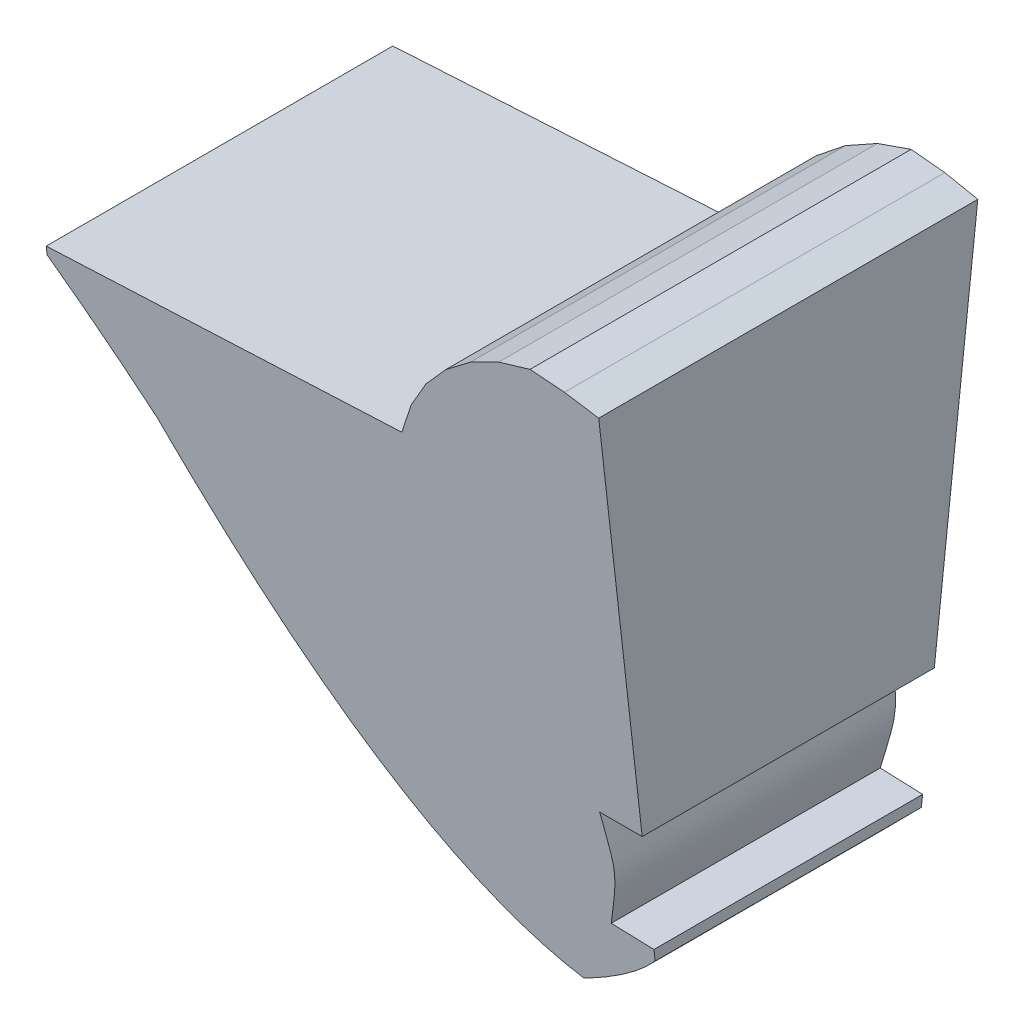
ISO-10303-21;
HEADER;
FILE_DESCRIPTION(('STEP AP214'),'2;1');
FILE_NAME('part.step','',(''),(''),'','','');
FILE_SCHEMA(('AUTOMOTIVE_DESIGN { 1 0 10303 214 1 1 1 1 }'));
ENDSEC;
DATA;
#1=APPLICATION_CONTEXT('core data for automotive mechanical design processes');
#2=APPLICATION_PROTOCOL_DEFINITION('international standard','automotive_design',2000,#1);
#3=PRODUCT_CONTEXT('',#1,'mechanical');
#4=PRODUCT('Part','Part','',(#3));
#5=PRODUCT_RELATED_PRODUCT_CATEGORY('part','',(#4));
#6=PRODUCT_DEFINITION_FORMATION('','',#4);
#7=PRODUCT_DEFINITION_CONTEXT('part definition',#1,'design');
#8=PRODUCT_DEFINITION('design','',#6,#7);
#9=PRODUCT_DEFINITION_SHAPE('','',#8);
#10=(LENGTH_UNIT() NAMED_UNIT(*) SI_UNIT(.MILLI.,.METRE.));
#11=(NAMED_UNIT(*) PLANE_ANGLE_UNIT() SI_UNIT($,.RADIAN.));
#12=(NAMED_UNIT(*) SI_UNIT($,.STERADIAN.) SOLID_ANGLE_UNIT());
#13=UNCERTAINTY_MEASURE_WITH_UNIT(LENGTH_MEASURE(1.E-05),#10,'distance_accuracy_value','');
#14=(GEOMETRIC_REPRESENTATION_CONTEXT(3) GLOBAL_UNCERTAINTY_ASSIGNED_CONTEXT((#13)) GLOBAL_UNIT_ASSIGNED_CONTEXT((#10,
#11,#12)) REPRESENTATION_CONTEXT('',''));
#15=CARTESIAN_POINT('',(0.,0.,0.));
#16=DIRECTION('',(0.,0.,1.));
#17=DIRECTION('',(1.,0.,0.));
#18=AXIS2_PLACEMENT_3D('',#15,#16,#17);
#19=CARTESIAN_POINT('',(0.355125000055651,-1.23774703808888E-13,7.21));
#20=DIRECTION('',(-1.,3.48538412642003E-13,0.));
#21=DIRECTION('',(-3.48538412642003E-13,-1.,0.));
#22=AXIS2_PLACEMENT_3D('',#19,#20,#21);
#23=PLANE('',#22);
#24=DIRECTION('',(0.,-0.993653373689782,0.112485434412263));
#25=VECTOR('',#24,1.);
#26=CARTESIAN_POINT('',(0.355125000056697,12.6081551722012,-7.21));
#27=LINE('',#26,#25);
#28=CARTESIAN_POINT('',(0.355125000056697,17.7734661064821,-7.79473332824248));
#29=VERTEX_POINT('',#28);
#30=CARTESIAN_POINT('',(0.355125000056447,1.97626956518499,-6.00642911422341));
#31=VERTEX_POINT('',#30);
#32=EDGE_CURVE('E58',#29,#31,#27,.T.);
#33=ORIENTED_EDGE('',*,*,#32,.F.);
#34=DIRECTION('',(0.,0.,-1.));
#35=VECTOR('',#34,1.);
#36=CARTESIAN_POINT('',(0.355125000056697,17.7734661064821,25.2255551646788));
#37=LINE('',#36,#35);
#38=CARTESIAN_POINT('',(0.355125000056697,17.7734661064821,7.79473332824248));
#39=VERTEX_POINT('',#38);
#40=EDGE_CURVE('E192',#39,#29,#37,.T.);
#41=ORIENTED_EDGE('',*,*,#40,.F.);
#42=DIRECTION('',(0.,0.993653373689782,0.112485434412263));
#43=VECTOR('',#42,1.);
#44=CARTESIAN_POINT('',(0.355125000056697,12.6081551722012,7.21));
#45=LINE('',#44,#43);
#46=CARTESIAN_POINT('',(0.355125000056697,1.97626956518499,6.00642911422342));
#47=VERTEX_POINT('',#46);
#48=EDGE_CURVE('E244',#47,#39,#45,.T.);
#49=ORIENTED_EDGE('',*,*,#48,.F.);
#50=DIRECTION('',(0.,0.,-1.));
#51=VECTOR('',#50,1.);
#52=CARTESIAN_POINT('',(0.355125000056447,1.97626956518499,7.21));
#53=LINE('',#52,#51);
#54=EDGE_CURVE('E316',#47,#31,#53,.T.);
#55=ORIENTED_EDGE('',*,*,#54,.T.);
#56=EDGE_LOOP('',(#33,#41,#49,#55));
#57=FACE_BOUND('',#56,.T.);
#58=ADVANCED_FACE('F43',(#57),#23,.F.);
#59=CARTESIAN_POINT('',(-23.0359211456035,0.,7.21));
#60=DIRECTION('',(-1.,0.,0.));
#61=DIRECTION('',(0.,0.,1.));
#62=AXIS2_PLACEMENT_3D('',#59,#60,#61);
#63=PLANE('',#62);
#64=DIRECTION('',(0.,0.,-1.));
#65=VECTOR('',#64,1.);
#66=CARTESIAN_POINT('',(-23.0359211456035,11.8716122879342,7.21));
#67=LINE('',#66,#65);
#68=CARTESIAN_POINT('',(-23.0359211456035,11.8716122879342,7.12662047501294));
#69=VERTEX_POINT('',#68);
#70=CARTESIAN_POINT('',(-23.0359211456035,11.8716122879342,-7.12662047501294));
#71=VERTEX_POINT('',#70);
#72=EDGE_CURVE('E325',#69,#71,#67,.T.);
#73=ORIENTED_EDGE('',*,*,#72,.T.);
#74=DIRECTION('',(0.,-0.993653373689782,0.112485434412263));
#75=VECTOR('',#74,1.);
#76=CARTESIAN_POINT('',(-23.0359211456035,12.6081551722012,-7.21));
#77=LINE('',#76,#75);
#78=CARTESIAN_POINT('',(-23.0359211456035,11.5401378200982,-7.08909627341673));
#79=VERTEX_POINT('',#78);
#80=EDGE_CURVE('E239',#71,#79,#77,.T.);
#81=ORIENTED_EDGE('',*,*,#80,.T.);
#82=DIRECTION('',(0.,0.,-1.));
#83=VECTOR('',#82,1.);
#84=CARTESIAN_POINT('',(-23.0359211456035,11.5401378200983,7.21));
#85=LINE('',#84,#83);
#86=CARTESIAN_POINT('',(-23.0359211456035,11.5401378200982,7.08909627341673));
#87=VERTEX_POINT('',#86);
#88=EDGE_CURVE('E319',#87,#79,#85,.T.);
#89=ORIENTED_EDGE('',*,*,#88,.F.);
#90=DIRECTION('',(0.,0.993653373689782,0.112485434412263));
#91=VECTOR('',#90,1.);
#92=CARTESIAN_POINT('',(-23.0359211456035,12.6081551722012,7.21));
#93=LINE('',#92,#91);
#94=EDGE_CURVE('E222',#87,#69,#93,.T.);
#95=ORIENTED_EDGE('',*,*,#94,.T.);
#96=EDGE_LOOP('',(#73,#81,#89,#95));
#97=FACE_BOUND('',#96,.T.);
#98=ADVANCED_FACE('F410',(#97),#63,.T.);
#99=CARTESIAN_POINT('',(-18.9451921135982,7.54091889574655,7.21));
#100=CARTESIAN_POINT('',(-10.2150083842792,-3.69764410322756,7.21));
#101=CARTESIAN_POINT('',(-2.84660482498738,-5.05908110388432,7.21));
#102=(BOUNDED_CURVE() B_SPLINE_CURVE(2,(#99,#100,#101),.UNSPECIFIED.,.F.,
.F.) B_SPLINE_CURVE_WITH_KNOTS((3,3),(0.497667241108509,0.499554279588011),
.UNSPECIFIED.) CURVE() GEOMETRIC_REPRESENTATION_ITEM() RATIONAL_B_SPLINE_CURVE((1.,1.,1.)) REPRESENTATION_ITEM(''));
#103=DIRECTION('',(0.,0.,-1.));
#104=VECTOR('',#103,1.);
#105=SURFACE_OF_LINEAR_EXTRUSION('',#102,#104);
#106=DIRECTION('',(0.,0.,-1.));
#107=VECTOR('',#106,1.);
#108=CARTESIAN_POINT('',(-18.9451921135982,7.54091889574657,7.21));
#109=LINE('',#108,#107);
#110=CARTESIAN_POINT('',(-18.9451921135982,7.54091889574657,6.63636910524442));
#111=VERTEX_POINT('',#110);
#112=CARTESIAN_POINT('',(-18.9451921135982,7.54091889574657,-6.63636910524442));
#113=VERTEX_POINT('',#112);
#114=EDGE_CURVE('E315',#111,#113,#109,.T.);
#115=ORIENTED_EDGE('',*,*,#114,.T.);
#116=CARTESIAN_POINT('',(-18.9451921135982,7.54091889574655,-6.63636910524441));
#117=CARTESIAN_POINT('',(-18.7033608655423,7.22962108931645,-6.60112898035273));
#118=CARTESIAN_POINT('',(-18.4592647140916,6.9200497206851,-6.56608429494821));
#119=CARTESIAN_POINT('',(-17.9661198805234,6.30464603742845,-6.49641819962467));
#120=CARTESIAN_POINT('',(-17.7170694462669,5.99881510969872,-6.46179694670763));
#121=CARTESIAN_POINT('',(-17.2137366178937,5.3913665824337,-6.39303140604553));
#122=CARTESIAN_POINT('',(-16.9594535947769,5.08974949683998,-6.35888717648066));
#123=CARTESIAN_POINT('',(-16.4451285665965,4.49103725761873,-6.29111061767257));
#124=CARTESIAN_POINT('',(-16.1850826962375,4.19394537928884,-6.25747865920581));
#125=CARTESIAN_POINT('',(-15.6590118901181,3.60508061675355,-6.1908168731366));
#126=CARTESIAN_POINT('',(-15.3929875534481,3.31330720485499,-6.15778698579723));
#127=CARTESIAN_POINT('',(-14.8544901847056,2.7357195544677,-6.09240181277284));
#128=CARTESIAN_POINT('',(-14.5820174931064,2.44990500284308,-6.06004649163962));
#129=CARTESIAN_POINT('',(-13.9777704357619,1.83142011947111,-5.99003159245484));
#130=CARTESIAN_POINT('',(-13.6445482479649,1.50014167377654,-5.95252958132897));
#131=CARTESIAN_POINT('',(-12.9673134934436,0.848664446736888,-5.87877982026175));
#132=CARTESIAN_POINT('',(-12.623301443116,0.528465136688492,-5.84253201046914));
#133=CARTESIAN_POINT('',(-11.9227759490938,-0.0995013958587514,-5.7714437516454));
#134=CARTESIAN_POINT('',(-11.5662405708663,-0.407244542107335,-5.73660602813964));
#135=CARTESIAN_POINT('',(-10.840142749037,-1.00720368374379,-5.66868831511867));
#136=CARTESIAN_POINT('',(-10.4705807273197,-1.29942018121482,-5.6356082687657));
#137=CARTESIAN_POINT('',(-9.71382699072171,-1.86779135556405,-5.57126643674768));
#138=CARTESIAN_POINT('',(-9.32650636654571,-2.14377746328672,-5.540023733768));
#139=CARTESIAN_POINT('',(-8.5360986768139,-2.67282289543975,-5.48013372902864));
#140=CARTESIAN_POINT('',(-8.13300835344273,-2.92587744631612,-5.45148696765387));
#141=CARTESIAN_POINT('',(-7.31201826568453,-3.40280761684766,-5.39749661363601));
#142=CARTESIAN_POINT('',(-6.89419365451789,-3.62680992502778,-5.37213867935817));
#143=CARTESIAN_POINT('',(-6.04187322097519,-4.0405536088069,-5.32530128189388));
#144=CARTESIAN_POINT('',(-5.60738935372736,-4.23031901573022,-5.30381909826786));
#145=CARTESIAN_POINT('',(-4.78985442909107,-4.54236533838515,-5.26849423842238));
#146=CARTESIAN_POINT('',(-4.4091055725695,-4.67052923075731,-5.25398558631979));
#147=CARTESIAN_POINT('',(-3.82960691198316,-4.83674345690554,-5.23516948814227));
#148=CARTESIAN_POINT('',(-3.63462104960687,-4.8878904691115,-5.22937944702812));
#149=CARTESIAN_POINT('',(-3.24229120544362,-4.9807402777546,-5.21886848683127));
#150=CARTESIAN_POINT('',(-3.0449461414238,-5.02243854990591,-5.21414807991536));
#151=CARTESIAN_POINT('',(-2.84660482498738,-5.05908110388432,-5.21));
#152=B_SPLINE_CURVE_WITH_KNOTS('',3,(#116,#117,#118,#119,#120,#121,#122,#123,#124,#125,#126,
#127,#128,#129,#130,#131,#132,#133,#134,#135,#136,#137,#138,#139,#140,#141,#142,#143,#144,#145,
#146,#147,#148,#149,#150,#151),.UNSPECIFIED.,.F.,.F.,(4,2,2,2,2,2,2,2,2,2,2,2,2,2,2,2,2,4),(0.,
1.1872997216569,2.37502708567824,3.56289806807204,4.75159146291787,5.9401662676152,
7.12867845491363,8.54255640265696,9.95636678593971,11.3727907462706,12.7891688759803,
14.2183172044781,15.6477623519031,17.0707480146133,18.4927309460623,19.6971402338765,
20.3019233237111,20.9069953892921),.UNSPECIFIED.);
#153=CARTESIAN_POINT('',(-2.84660482498738,-5.05908110388432,-5.21));
#154=VERTEX_POINT('',#153);
#155=EDGE_CURVE('E356',#113,#154,#152,.T.);
#156=ORIENTED_EDGE('',*,*,#155,.T.);
#157=DIRECTION('',(0.,0.,-1.));
#158=VECTOR('',#157,1.);
#159=CARTESIAN_POINT('',(-2.84660482498738,-5.05908110388432,7.21));
#160=LINE('',#159,#158);
#161=CARTESIAN_POINT('',(-2.84660482498738,-5.05908110388432,5.21));
#162=VERTEX_POINT('',#161);
#163=EDGE_CURVE('E340',#162,#154,#160,.T.);
#164=ORIENTED_EDGE('',*,*,#163,.F.);
#165=CARTESIAN_POINT('',(-2.84660482498738,-5.05908110388432,5.21));
#166=CARTESIAN_POINT('',(-3.0836355452615,-5.01529762547054,5.21495646039138));
#167=CARTESIAN_POINT('',(-3.31925014057108,-4.96428184629726,5.22073164541478));
#168=CARTESIAN_POINT('',(-3.78628189704186,-4.84911384389608,5.23376911212451));
#169=CARTESIAN_POINT('',(-4.01771143135529,-4.78501130060695,5.24102576984815));
#170=CARTESIAN_POINT('',(-4.47638324853452,-4.64477679089168,5.25690086287615));
#171=CARTESIAN_POINT('',(-4.70363211310206,-4.56866593727755,5.26551690812791));
#172=CARTESIAN_POINT('',(-5.1539801611568,-4.40545252874729,5.28399330205617));
#173=CARTESIAN_POINT('',(-5.37708095327682,-4.31835434125152,5.29385315632366));
#174=CARTESIAN_POINT('',(-5.81545834234536,-4.13567110279715,5.31453361087802));
#175=CARTESIAN_POINT('',(-6.03080317783365,-4.04024711994086,5.32533597762798));
#176=CARTESIAN_POINT('',(-6.45748946905634,-3.84057736608456,5.34793937192645));
#177=CARTESIAN_POINT('',(-6.66882789943329,-3.73632522989765,5.35974112003892));
#178=CARTESIAN_POINT('',(-7.08747417766979,-3.51983158147829,5.38424904476877));
#179=CARTESIAN_POINT('',(-7.29477947597257,-3.40758521204135,5.39695577124062));
#180=CARTESIAN_POINT('',(-7.70530843131035,-3.17590609220346,5.42318275051655));
#181=CARTESIAN_POINT('',(-7.90853147430462,-3.0564722713248,5.43670312450288));
#182=CARTESIAN_POINT('',(-8.45410340689061,-2.72385368196738,5.47435684511425));
#183=CARTESIAN_POINT('',(-8.79259906035209,-2.50440768840731,5.49919898682003));
#184=CARTESIAN_POINT('',(-9.45845448583479,-2.04949644973372,5.5506967119384));
#185=CARTESIAN_POINT('',(-9.78581359629267,-1.81403025542841,5.5773524028032));
#186=CARTESIAN_POINT('',(-10.4302582396863,-1.32938575303013,5.63221604925302));
#187=CARTESIAN_POINT('',(-10.7473396395034,-1.08020203459831,5.66042461730948));
#188=CARTESIAN_POINT('',(-11.3718438106499,-0.570176876647104,5.71816145288252));
#189=CARTESIAN_POINT('',(-11.6792662750814,-0.309335067346119,5.74768976225981));
#190=CARTESIAN_POINT('',(-12.2887351366992,0.225514030316342,5.80823676455314));
#191=CARTESIAN_POINT('',(-12.5906756597182,0.499640146613562,5.83926890925461));
#192=CARTESIAN_POINT('',(-13.1859914625247,1.05668157973797,5.90232817041119));
#193=CARTESIAN_POINT('',(-13.4793699933214,1.33959347409339,5.93435489942917));
#194=CARTESIAN_POINT('',(-14.0582984741035,1.91313890151101,5.99928247705986));
#195=CARTESIAN_POINT('',(-14.3438493181123,2.20377154523463,6.03218322499598));
#196=CARTESIAN_POINT('',(-14.9077244427009,2.7918210558895,6.09875272137508));
#197=CARTESIAN_POINT('',(-15.1860493084316,3.08923736980037,6.13242140721399));
#198=CARTESIAN_POINT('',(-15.7683607406539,3.72540309630891,6.20443784674841));
#199=CARTESIAN_POINT('',(-16.0715178451228,4.06490144250158,6.24287038264565));
#200=CARTESIAN_POINT('',(-16.6701836985208,4.7504922746204,6.32048193675692));
#201=CARTESIAN_POINT('',(-16.9656923307507,5.09658486102068,6.35966096634501));
#202=CARTESIAN_POINT('',(-17.4495199616275,5.67490501691598,6.42512906184765));
#203=CARTESIAN_POINT('',(-17.6398456690967,5.90547984199544,6.45123103065322));
#204=CARTESIAN_POINT('',(-18.0176052393411,6.36895711711416,6.50369846448112));
#205=CARTESIAN_POINT('',(-18.205039097963,6.60185957049552,6.5300639298818));
#206=CARTESIAN_POINT('',(-18.5771476687389,7.06981539005112,6.58303835239394));
#207=CARTESIAN_POINT('',(-18.7618224957771,7.30486866600559,6.60964729929217));
#208=CARTESIAN_POINT('',(-18.9451921135982,7.54091889574655,6.63636910524441));
#209=B_SPLINE_CURVE_WITH_KNOTS('',3,(#165,#166,#167,#168,#169,#170,#171,#172,#173,#174,#175,
#176,#177,#178,#179,#180,#181,#182,#183,#184,#185,#186,#187,#188,#189,#190,#191,#192,#193,#194,
#195,#196,#197,#198,#199,#200,#201,#202,#203,#204,#205,#206,#207,#208),.UNSPECIFIED.,.F.,.F.,(4,
2,2,2,2,2,2,2,2,2,2,2,2,2,2,2,2,2,2,2,2,4),(0.,0.723070627629283,1.44344574109941,
2.16256813451498,2.88140557514503,3.58855192345824,4.2962125448096,5.0043068623572,
5.71250690363926,6.92441762508089,8.13640021448464,9.3488642962315,10.5613668633146,
11.788141520998,13.0144441434254,14.2406061176645,15.4666684871313,16.8368576095009,
18.2070676256843,19.1073954524656,20.0077245721621,20.9080160976373),.UNSPECIFIED.);
#210=EDGE_CURVE('E274',#162,#111,#209,.T.);
#211=ORIENTED_EDGE('',*,*,#210,.T.);
#212=EDGE_LOOP('',(#115,#156,#164,#211));
#213=FACE_BOUND('',#212,.T.);
#214=ADVANCED_FACE('F44',(#213),#105,.F.);
#215=CARTESIAN_POINT('',(-2.84660482498738,-5.05908110388432,7.21));
#216=CARTESIAN_POINT('',(-0.742366881974002,-3.93520659958673,7.21));
#217=CARTESIAN_POINT('',(0.355124999965198,-2.72325322699678,7.21));
#218=(BOUNDED_CURVE() B_SPLINE_CURVE(2,(#215,#216,#217),.UNSPECIFIED.,.F.,
.F.) B_SPLINE_CURVE_WITH_KNOTS((3,3),(0.498812074629495,0.499412845463797),
.UNSPECIFIED.) CURVE() GEOMETRIC_REPRESENTATION_ITEM() RATIONAL_B_SPLINE_CURVE((1.,1.,1.)) REPRESENTATION_ITEM(''));
#219=DIRECTION('',(0.,0.,-1.));
#220=VECTOR('',#219,1.);
#221=SURFACE_OF_LINEAR_EXTRUSION('',#218,#220);
#222=ORIENTED_EDGE('',*,*,#163,.T.);
#223=CARTESIAN_POINT('',(-2.84660482498738,-5.05908110388432,-5.21));
#224=CARTESIAN_POINT('',(-2.67154367534484,-4.96554243060771,-5.22058894235803));
#225=CARTESIAN_POINT('',(-2.49778385523126,-4.86952307483158,-5.23145870764283));
#226=CARTESIAN_POINT('',(-2.15332890723938,-4.67164155861341,-5.25385966647147));
#227=CARTESIAN_POINT('',(-1.9826387176766,-4.56977092703724,-5.26539181898071));
#228=CARTESIAN_POINT('',(-1.64527137465746,-4.35955519460265,-5.2891890591545));
#229=CARTESIAN_POINT('',(-1.47859514121983,-4.25120862887406,-5.30145431264808));
#230=CARTESIAN_POINT('',(-1.15044448784201,-4.02724001195876,-5.32680843294344));
#231=CARTESIAN_POINT('',(-0.98896568487432,-3.911624347545,-5.33989657673763));
#232=CARTESIAN_POINT('',(-0.724614348138144,-3.7114805449727,-5.36255363519824));
#233=CARTESIAN_POINT('',(-0.619967455079453,-3.6292658395869,-5.37186066025876));
#234=CARTESIAN_POINT('',(-0.414118763296717,-3.46070156785231,-5.39094279275538));
#235=CARTESIAN_POINT('',(-0.312916415666604,-3.3743526656372,-5.40071782500895));
#236=CARTESIAN_POINT('',(-0.114288127047668,-3.19685300163986,-5.42081147873311));
#237=CARTESIAN_POINT('',(-0.0168745915935634,-3.10568844995875,-5.431131661274));
#238=CARTESIAN_POINT('',(0.173044677325633,-2.91833195578561,-5.45234114658855));
#239=CARTESIAN_POINT('',(0.265547074526193,-2.82213668167119,-5.46323082651485));
#240=CARTESIAN_POINT('',(0.355124999965198,-2.72325322699678,-5.47442481895704));
#241=B_SPLINE_CURVE_WITH_KNOTS('',3,(#223,#224,#225,#226,#227,#228,#229,#230,#231,#232,#233,
#234,#235,#236,#237,#238,#239,#240),.UNSPECIFIED.,.F.,.F.,(4,2,2,2,2,2,2,2,4),(0.,
0.596333361221147,1.19355295493407,1.79090815604603,2.38774565156578,2.78786762990545,
3.18792554534165,3.58919872466333,3.99074110013676),.UNSPECIFIED.);
#242=CARTESIAN_POINT('',(0.355125000010947,-2.72325322699678,-5.47442481895703));
#243=VERTEX_POINT('',#242);
#244=EDGE_CURVE('E362',#154,#243,#241,.T.);
#245=ORIENTED_EDGE('',*,*,#244,.T.);
#246=DIRECTION('',(0.,0.,-1.));
#247=VECTOR('',#246,1.);
#248=CARTESIAN_POINT('',(0.355124999965198,-2.72325322699678,7.21));
#249=LINE('',#248,#247);
#250=CARTESIAN_POINT('',(0.355125000010947,-2.72325322699678,5.47442481895703));
#251=VERTEX_POINT('',#250);
#252=EDGE_CURVE('E335',#251,#243,#249,.T.);
#253=ORIENTED_EDGE('',*,*,#252,.F.);
#254=CARTESIAN_POINT('',(0.355124999965198,-2.72325322699678,5.47442481895703));
#255=CARTESIAN_POINT('',(0.288265800066398,-2.79707578870119,5.46606781726749));
#256=CARTESIAN_POINT('',(0.219762299322532,-2.86939557158838,5.45788093599675));
#257=CARTESIAN_POINT('',(0.0798741499126208,-3.0111837154317,5.44182996553056));
#258=CARTESIAN_POINT('',(0.00849051694650479,-3.08065306448068,5.43396576447915));
#259=CARTESIAN_POINT('',(-0.209110404202349,-3.28478130911614,5.41085765164865));
#260=CARTESIAN_POINT('',(-0.359086186155244,-3.41549544786354,5.39606030171743));
#261=CARTESIAN_POINT('',(-0.666431647279958,-3.66745151891472,5.36753789253992));
#262=CARTESIAN_POINT('',(-0.823790135326829,-3.78870709059741,5.35381128926277));
#263=CARTESIAN_POINT('',(-1.14463764434189,-4.02329424679429,5.32725510893767));
#264=CARTESIAN_POINT('',(-1.30813354467851,-4.13661650521983,5.31442658763929));
#265=CARTESIAN_POINT('',(-1.58497175174893,-4.31986712055689,5.29368190381061));
#266=CARTESIAN_POINT('',(-1.69701528140079,-4.39175032218513,5.28554444523986));
#267=CARTESIAN_POINT('',(-1.92294333828473,-4.53261962763427,5.26959749086083));
#268=CARTESIAN_POINT('',(-2.03682799400811,-4.6016055280346,5.26178801808056));
#269=CARTESIAN_POINT('',(-2.26591352019373,-4.73675126913538,5.24648899349189));
#270=CARTESIAN_POINT('',(-2.38111062922232,-4.80291742324192,5.23899872698133));
#271=CARTESIAN_POINT('',(-2.6128736149529,-4.93278949726635,5.22429670205848));
#272=CARTESIAN_POINT('',(-2.72943923096306,-4.99649587614853,5.21708489168965));
#273=CARTESIAN_POINT('',(-2.84660482498738,-5.05908110388432,5.21));
#274=B_SPLINE_CURVE_WITH_KNOTS('',3,(#254,#255,#256,#257,#258,#259,#260,#261,#262,#263,#264,
#265,#266,#267,#268,#269,#270,#271,#272,#273),.UNSPECIFIED.,.F.,.F.,(4,2,2,2,2,2,2,2,2,4),(0.,
0.299782926841572,0.599461041577767,1.1974499434567,1.79455995327913,2.39236050766276,
2.79242459253001,3.19251671924541,3.59166012626068,3.99072869445439),.UNSPECIFIED.);
#275=EDGE_CURVE('E279',#251,#162,#274,.T.);
#276=ORIENTED_EDGE('',*,*,#275,.T.);
#277=EDGE_LOOP('',(#222,#245,#253,#276));
#278=FACE_BOUND('',#277,.T.);
#279=ADVANCED_FACE('F289',(#278),#221,.F.);
#280=CARTESIAN_POINT('',(0.355125000532009,-7.39148800447813E-11,7.21));
#281=DIRECTION('',(1.,-2.08137641489758E-10,0.));
#282=DIRECTION('',(2.08137641489758E-10,1.,0.));
#283=AXIS2_PLACEMENT_3D('',#280,#281,#282);
#284=PLANE('',#283);
#285=CARTESIAN_POINT('',(0.355125000056697,-2.28484178142546,-5.52405470319249));
#286=VERTEX_POINT('',#285);
#287=EDGE_CURVE('E240',#286,#243,#27,.T.);
#288=ORIENTED_EDGE('',*,*,#287,.F.);
#289=DIRECTION('',(0.,0.,-1.));
#290=VECTOR('',#289,1.);
#291=CARTESIAN_POINT('',(0.355125000056447,-2.28484178142545,7.21));
#292=LINE('',#291,#290);
#293=CARTESIAN_POINT('',(0.355125000056697,-2.28484178142546,5.52405470319249));
#294=VERTEX_POINT('',#293);
#295=EDGE_CURVE('E333',#294,#286,#292,.T.);
#296=ORIENTED_EDGE('',*,*,#295,.F.);
#297=EDGE_CURVE('E237',#251,#294,#45,.T.);
#298=ORIENTED_EDGE('',*,*,#297,.F.);
#299=ORIENTED_EDGE('',*,*,#252,.T.);
#300=EDGE_LOOP('',(#288,#296,#298,#299));
#301=FACE_BOUND('',#300,.T.);
#302=ADVANCED_FACE('F294',(#301),#284,.T.);
#303=CARTESIAN_POINT('',(-0.0792587195419091,-2.26967276768239,7.21));
#304=DIRECTION('',(-0.0348994967024901,-0.999390827019096,0.));
#305=DIRECTION('',(0.999390827019096,-0.0348994967024901,0.));
#306=AXIS2_PLACEMENT_3D('',#303,#304,#305);
#307=PLANE('',#306);
#308=ORIENTED_EDGE('',*,*,#295,.T.);
#309=DIRECTION('',(-0.999383027616045,0.034899224341334,-0.00395072820626436));
#310=VECTOR('',#309,1.);
#311=CARTESIAN_POINT('',(-0.0289741896082848,-2.2714287421612,-5.52557311151111));
#312=LINE('',#311,#310);
#313=CARTESIAN_POINT('',(-1.39487499994356,-2.22373043481491,-5.5309727457947));
#314=VERTEX_POINT('',#313);
#315=EDGE_CURVE('E348',#286,#314,#312,.T.);
#316=ORIENTED_EDGE('',*,*,#315,.T.);
#317=DIRECTION('',(0.,0.,-1.));
#318=VECTOR('',#317,1.);
#319=CARTESIAN_POINT('',(-1.39487499994356,-2.22373043481491,7.21));
#320=LINE('',#319,#318);
#321=CARTESIAN_POINT('',(-1.39487499994356,-2.22373043481491,5.5309727457947));
#322=VERTEX_POINT('',#321);
#323=EDGE_CURVE('E330',#322,#314,#320,.T.);
#324=ORIENTED_EDGE('',*,*,#323,.F.);
#325=DIRECTION('',(0.999383027616045,-0.034899224341334,-0.00395072820626436));
#326=VECTOR('',#325,1.);
#327=CARTESIAN_POINT('',(-0.0859085417339361,-2.26944055077446,5.52579818252456));
#328=LINE('',#327,#326);
#329=EDGE_CURVE('E251',#322,#294,#328,.T.);
#330=ORIENTED_EDGE('',*,*,#329,.T.);
#331=EDGE_LOOP('',(#308,#316,#324,#330));
#332=FACE_BOUND('',#331,.T.);
#333=ADVANCED_FACE('F420',(#332),#307,.F.);
#334=CARTESIAN_POINT('',(-1.39487499994356,-2.22373043481491,7.21));
#335=CARTESIAN_POINT('',(-0.907530669798052,-0.123730434814926,7.21));
#336=CARTESIAN_POINT('',(-1.39487499994356,1.976269565185,7.21));
#337=(BOUNDED_CURVE() B_SPLINE_CURVE(2,(#334,#335,#336),.UNSPECIFIED.,.F.,
.F.) B_SPLINE_CURVE_WITH_KNOTS((3,3),(0.,1.),
.UNSPECIFIED.) CURVE() GEOMETRIC_REPRESENTATION_ITEM() RATIONAL_B_SPLINE_CURVE((1.,
3.23180121851367,1.)) REPRESENTATION_ITEM(''));
#338=DIRECTION('',(0.,0.,-1.));
#339=VECTOR('',#338,1.);
#340=SURFACE_OF_LINEAR_EXTRUSION('',#337,#339);
#341=ORIENTED_EDGE('',*,*,#323,.T.);
#342=CARTESIAN_POINT('',(-1.39487499994356,-2.22373043481491,-5.5309727457947));
#343=CARTESIAN_POINT('',(-1.38202447122813,-2.16835021356968,-5.53724200266994));
#344=CARTESIAN_POINT('',(-1.36921744547373,-2.11295996104296,-5.54351239512535));
#345=CARTESIAN_POINT('',(-1.34371955909939,-2.00215267308472,-5.55605621196536));
#346=CARTESIAN_POINT('',(-1.33102869927897,-1.94673563747162,-5.56232963637053));
#347=CARTESIAN_POINT('',(-1.30579250980865,-1.83586894873068,-5.57488017761064));
#348=CARTESIAN_POINT('',(-1.29324717983284,-1.78041929567618,-5.58115729443729));
#349=CARTESIAN_POINT('',(-1.26834035470031,-1.66945670178657,-5.593718692514));
#350=CARTESIAN_POINT('',(-1.25597893242913,-1.61394374477822,-5.60000297559494));
#351=CARTESIAN_POINT('',(-1.23150428056634,-1.50286329328951,-5.61257771561119));
#352=CARTESIAN_POINT('',(-1.21939105277074,-1.44729579841754,-5.61886817259083));
#353=CARTESIAN_POINT('',(-1.19550012207595,-1.33608743052918,-5.63145739324204));
#354=CARTESIAN_POINT('',(-1.1837224309966,-1.2804465549999,-5.63775615719808));
#355=CARTESIAN_POINT('',(-1.15485704104805,-1.14125615214793,-5.65351305326002));
#356=CARTESIAN_POINT('',(-1.13805530724695,-1.05764770999797,-5.66297785475397));
#357=CARTESIAN_POINT('',(-1.10616760722362,-0.890046794372652,-5.68195093158457));
#358=CARTESIAN_POINT('',(-1.09108267359643,-0.806054121054038,-5.69145922954426));
#359=CARTESIAN_POINT('',(-1.06839764881353,-0.664871544058104,-5.70744164748328));
#360=CARTESIAN_POINT('',(-1.05995626751594,-0.607817685780514,-5.71390036659317));
#361=CARTESIAN_POINT('',(-1.04516806244473,-0.493450404650502,-5.72684718853439));
#362=CARTESIAN_POINT('',(-1.03882061818002,-0.436137063802354,-5.73333528208253));
#363=CARTESIAN_POINT('',(-1.02903068414648,-0.32130807468907,-5.74633437116685));
#364=CARTESIAN_POINT('',(-1.02558541499307,-0.263792673078832,-5.75284533878074));
#365=CARTESIAN_POINT('',(-1.02222407231355,-0.148714957691158,-5.76587258464866));
#366=CARTESIAN_POINT('',(-1.02230420900467,-0.0911527608046728,-5.77238884967019));
#367=CARTESIAN_POINT('',(-1.02596900528622,0.0239015023985969,-5.78541344065945));
#368=CARTESIAN_POINT('',(-1.02955657044098,0.0813934710005598,-5.79192175556548));
#369=CARTESIAN_POINT('',(-1.03959132289802,0.19613338530381,-5.80491076103415));
#370=CARTESIAN_POINT('',(-1.04603929917214,0.253381259276289,-5.81139144347682));
#371=CARTESIAN_POINT('',(-1.05997220439613,0.35983137212623,-5.8234420111136));
#372=CARTESIAN_POINT('',(-1.06719667195452,0.409068491171902,-5.82901584487869));
#373=CARTESIAN_POINT('',(-1.08274764683563,0.507347946837772,-5.84014146227917));
#374=CARTESIAN_POINT('',(-1.0910737056158,0.556390354412903,-5.84569325394695));
#375=CARTESIAN_POINT('',(-1.10853037258208,0.654424381213792,-5.85679108784343));
#376=CARTESIAN_POINT('',(-1.11766242226862,0.70341574413319,-5.86233710105724));
#377=CARTESIAN_POINT('',(-1.1364977866421,0.801294033672846,-5.8734173048888));
#378=CARTESIAN_POINT('',(-1.14620115522269,0.850180949988233,-5.87895149433999));
#379=CARTESIAN_POINT('',(-1.16833495400599,0.959258362431623,-5.89129948252998));
#380=CARTESIAN_POINT('',(-1.1808737668477,1.01942705832357,-5.89811081339709));
#381=CARTESIAN_POINT('',(-1.20639174214038,1.13967062360228,-5.91172285360526));
#382=CARTESIAN_POINT('',(-1.21937089694786,1.19974549459873,-5.91852356312855));
#383=CARTESIAN_POINT('',(-1.24564626429316,1.31982703510014,-5.93211726150049));
#384=CARTESIAN_POINT('',(-1.2589424791072,1.37983370411223,-5.93891025029334));
#385=CARTESIAN_POINT('',(-1.28569888355067,1.49948275843749,-5.95245498954463));
#386=CARTESIAN_POINT('',(-1.29915785770072,1.55912541262012,-5.95920677044014));
#387=CARTESIAN_POINT('',(-1.32625009614692,1.67837055204035,-5.97270578495002));
#388=CARTESIAN_POINT('',(-1.33988335761136,1.73797303791406,-5.97945301863641));
#389=CARTESIAN_POINT('',(-1.36728618039678,1.85714403003134,-5.99294363938264));
#390=CARTESIAN_POINT('',(-1.381055735056,1.91671253778666,-5.9996870266136));
#391=CARTESIAN_POINT('',(-1.39487499994356,1.976269565185,-6.00642911422342));
#392=B_SPLINE_CURVE_WITH_KNOTS('',3,(#342,#343,#344,#345,#346,#347,#348,#349,#350,#351,#352,
#353,#354,#355,#356,#357,#358,#359,#360,#361,#362,#363,#364,#365,#366,#367,#368,#369,#370,#371,
#372,#373,#374,#375,#376,#377,#378,#379,#380,#381,#382,#383,#384,#385,#386,#387,#388,#389,#390,
#391),.UNSPECIFIED.,.F.,.F.,(4,2,2,2,2,2,2,2,2,2,2,2,2,2,2,2,2,2,2,2,2,2,2,2,4),(0.,
0.171588763273453,0.343178706622211,0.514768265617105,0.686424107910212,0.858081191922479,
1.02974431538338,1.28714724145325,1.54470417716685,1.71878537631805,1.8928149439917,
2.06667765516018,2.24035346989174,2.41417328020677,2.58804106414591,2.73825198714263,
2.88840193486919,3.03882608638502,3.18926445051695,3.37477476712053,3.56028186526787,
3.74579029559563,3.93033206952695,4.11487084894101,4.29940065253389),.UNSPECIFIED.);
#393=CARTESIAN_POINT('',(-1.39487499994356,1.976269565185,-6.00642911422342));
#394=VERTEX_POINT('',#393);
#395=EDGE_CURVE('E346',#314,#394,#392,.T.);
#396=ORIENTED_EDGE('',*,*,#395,.T.);
#397=DIRECTION('',(0.,0.,-1.));
#398=VECTOR('',#397,1.);
#399=CARTESIAN_POINT('',(-1.39487499994356,1.976269565185,7.21));
#400=LINE('',#399,#398);
#401=CARTESIAN_POINT('',(-1.39487499994356,1.976269565185,6.00642911422342));
#402=VERTEX_POINT('',#401);
#403=EDGE_CURVE('E324',#402,#394,#400,.T.);
#404=ORIENTED_EDGE('',*,*,#403,.F.);
#405=CARTESIAN_POINT('',(-1.39487499994356,1.976269565185,6.00642911422342));
#406=CARTESIAN_POINT('',(-1.37907511533365,1.90817072448153,5.99872006005792));
#407=CARTESIAN_POINT('',(-1.36333836969219,1.84005724657732,5.99100934890426));
#408=CARTESIAN_POINT('',(-1.33204781411177,1.703774616767,5.97558162408294));
#409=CARTESIAN_POINT('',(-1.31649404111311,1.63560545649229,5.96786460946793));
#410=CARTESIAN_POINT('',(-1.28563112684324,1.49920642241426,5.95242370722985));
#411=CARTESIAN_POINT('',(-1.27032200601989,1.43097654403409,5.94469981908867));
#412=CARTESIAN_POINT('',(-1.2399275173513,1.29390485970128,5.92918277022027));
#413=CARTESIAN_POINT('',(-1.22484485449072,1.22506245970345,5.92138954224482));
#414=CARTESIAN_POINT('',(-1.19518112320204,1.0872751663326,5.90579148364441));
#415=CARTESIAN_POINT('',(-1.18060002365467,1.01833027959621,5.89798665377074));
#416=CARTESIAN_POINT('',(-1.1521828568661,0.880291295746957,5.88236010282727));
#417=CARTESIAN_POINT('',(-1.13834675067045,0.81119720663251,5.87453838266293));
#418=CARTESIAN_POINT('',(-1.11516473949854,0.690174385789182,5.86083812768789));
#419=CARTESIAN_POINT('',(-1.10556404533104,0.638294159941606,5.85496508393199));
#420=CARTESIAN_POINT('',(-1.08728934318226,0.534373551286744,5.8432008660282));
#421=CARTESIAN_POINT('',(-1.07861528667302,0.482333177013413,5.83730969284637));
#422=CARTESIAN_POINT('',(-1.06260440200736,0.378149691610768,5.82551571627023));
#423=CARTESIAN_POINT('',(-1.05526500549272,0.326006977236309,5.81961295779011));
#424=CARTESIAN_POINT('',(-1.04244257361275,0.221494061638693,5.80778168843203));
#425=CARTESIAN_POINT('',(-1.03695934618146,0.169123884520429,5.80185318028283));
#426=CARTESIAN_POINT('',(-1.02917052981484,0.0729301509045451,5.79096367474698));
#427=CARTESIAN_POINT('',(-1.02648754730517,0.029137538921467,5.78600618039996));
#428=CARTESIAN_POINT('',(-1.02311803398459,-0.0585228047861233,5.77608268785843));
#429=CARTESIAN_POINT('',(-1.02243133042271,-0.10239052968188,5.77111669043696));
#430=CARTESIAN_POINT('',(-1.02313587995194,-0.190112899664058,5.76118617627941));
#431=CARTESIAN_POINT('',(-1.02452732528276,-0.233967543165022,5.75622165972282));
#432=CARTESIAN_POINT('',(-1.02922830316647,-0.321575626235211,5.74630408328911));
#433=CARTESIAN_POINT('',(-1.03253802615093,-0.365329055323648,5.74135102459847));
#434=CARTESIAN_POINT('',(-1.04481913269156,-0.496026010219698,5.72655561994619));
#435=CARTESIAN_POINT('',(-1.05614963950478,-0.582745183351363,5.71673867158183));
#436=CARTESIAN_POINT('',(-1.08246686740171,-0.755641929816293,5.69716608606103));
#437=CARTESIAN_POINT('',(-1.09745579058543,-0.84181914476287,5.68741048947536));
#438=CARTESIAN_POINT('',(-1.129420439335,-1.01366509487317,5.66795685819712));
#439=CARTESIAN_POINT('',(-1.14639302616418,-1.09933441387988,5.65825875741124));
#440=CARTESIAN_POINT('',(-1.18149622255001,-1.27039766561497,5.63889373063944));
#441=CARTESIAN_POINT('',(-1.19962634896168,-1.35579169781193,5.62922679339328));
#442=CARTESIAN_POINT('',(-1.24641099322308,-1.57177275123237,5.60477689641502));
#443=CARTESIAN_POINT('',(-1.2755379218154,-1.70225834502177,5.59000541866374));
#444=CARTESIAN_POINT('',(-1.31987060164556,-1.89787014932725,5.56786140006925));
#445=CARTESIAN_POINT('',(-1.33475842772637,-1.96306843680887,5.56048069983263));
#446=CARTESIAN_POINT('',(-1.36470186719661,-2.09342597092531,5.54572371893541));
#447=CARTESIAN_POINT('',(-1.37975747811874,-2.15858521811941,5.53834743821149));
#448=CARTESIAN_POINT('',(-1.39487499994356,-2.22373043481491,5.5309727457947));
#449=B_SPLINE_CURVE_WITH_KNOTS('',3,(#405,#406,#407,#408,#409,#410,#411,#412,#413,#414,#415,
#416,#417,#418,#419,#420,#421,#422,#423,#424,#425,#426,#427,#428,#429,#430,#431,#432,#433,#434,
#435,#436,#437,#438,#439,#440,#441,#442,#443,#444,#445,#446,#447,#448),.UNSPECIFIED.,.F.,.F.,(4,
2,2,2,2,2,2,2,2,2,2,2,2,2,2,2,2,2,2,2,2,4),(0.,0.210994688118994,0.422031267037357,
0.633085392962154,0.845798629208893,1.05849864386888,1.27118752598179,1.4304428147189,
1.58968975917224,1.7486269361582,1.90754766218714,2.03996993828288,2.1723807546786,
2.3048038205294,2.43724003455642,2.70109168787962,2.96510255404671,3.22870119353186,
3.49219051999256,3.89571487778355,4.09756249770236,4.29940715332609),.UNSPECIFIED.);
#450=EDGE_CURVE('E66',#402,#322,#449,.T.);
#451=ORIENTED_EDGE('',*,*,#450,.T.);
#452=EDGE_LOOP('',(#341,#396,#404,#451));
#453=FACE_BOUND('',#452,.T.);
#454=ADVANCED_FACE('F256',(#453),#340,.F.);
#455=CARTESIAN_POINT('',(-0.683557287645435,13.0430500394562,7.21));
#456=DIRECTION('',(0.0523359562429403,-0.998629534754574,0.));
#457=DIRECTION('',(0.998629534754574,0.0523359562429403,0.));
#458=AXIS2_PLACEMENT_3D('',#455,#456,#457);
#459=PLANE('',#458);
#460=DIRECTION('',(0.998612008623237,0.0523350377373175,0.00592453023432517));
#461=VECTOR('',#460,1.);
#462=CARTESIAN_POINT('',(-0.683848558053945,13.0430347746209,7.25923006582624));
#463=LINE('',#462,#461);
#464=CARTESIAN_POINT('',(-8.32331873887405,12.6426671075451,7.2139068855824));
#465=VERTEX_POINT('',#464);
#466=EDGE_CURVE('E287',#69,#465,#463,.T.);
#467=ORIENTED_EDGE('',*,*,#466,.T.);
#468=DIRECTION('',(0.,0.,-1.));
#469=VECTOR('',#468,1.);
#470=CARTESIAN_POINT('',(-8.32331873887405,12.6426671075451,25.2255551646788));
#471=LINE('',#470,#469);
#472=CARTESIAN_POINT('',(-8.32331873887405,12.6426671075451,-7.2139068855824));
#473=VERTEX_POINT('',#472);
#474=EDGE_CURVE('E196',#465,#473,#471,.T.);
#475=ORIENTED_EDGE('',*,*,#474,.T.);
#476=DIRECTION('',(-0.998612008623237,-0.0523350377373175,0.00592453023432517));
#477=VECTOR('',#476,1.);
#478=CARTESIAN_POINT('',(-0.769161705533953,13.0385637020178,-7.25872392298271));
#479=LINE('',#478,#477);
#480=EDGE_CURVE('E375',#473,#71,#479,.T.);
#481=ORIENTED_EDGE('',*,*,#480,.T.);
#482=ORIENTED_EDGE('',*,*,#72,.F.);
#483=EDGE_LOOP('',(#467,#475,#481,#482));
#484=FACE_BOUND('',#483,.T.);
#485=ADVANCED_FACE('F407',(#484),#459,.F.);
#486=CARTESIAN_POINT('',(-69.8841339427642,-40.4718315495759,7.21));
#487=DIRECTION('',(0.,0.,-1.));
#488=DIRECTION('',(-1.,0.,0.));
#489=AXIS2_PLACEMENT_3D('',#486,#487,#488);
#490=CYLINDRICAL_SURFACE('',#489,69.9999999999998);
#491=CARTESIAN_POINT('',(-69.8841339427642,-40.4718315495759,-1.20113863738535));
#492=DIRECTION('',(0.,0.112485434412263,0.993653373689781));
#493=DIRECTION('',(0.,0.993653373689782,-0.112485434412263));
#494=AXIS2_PLACEMENT_3D('',#491,#492,#493);
#495=ELLIPSE('',#494,70.4471014273976,69.9999999999998);
#496=EDGE_CURVE('E347',#113,#79,#495,.T.);
#497=ORIENTED_EDGE('',*,*,#496,.F.);
#498=ORIENTED_EDGE('',*,*,#114,.F.);
#499=CARTESIAN_POINT('',(-69.8841339427642,-40.4718315495759,1.20113863738535));
#500=DIRECTION('',(0.,0.112485434412263,-0.993653373689781));
#501=DIRECTION('',(0.,-0.993653373689782,-0.112485434412263));
#502=AXIS2_PLACEMENT_3D('',#499,#500,#501);
#503=ELLIPSE('',#502,70.4471014273976,69.9999999999998);
#504=EDGE_CURVE('E284',#87,#111,#503,.T.);
#505=ORIENTED_EDGE('',*,*,#504,.F.);
#506=ORIENTED_EDGE('',*,*,#88,.T.);
#507=EDGE_LOOP('',(#497,#498,#505,#506));
#508=FACE_BOUND('',#507,.T.);
#509=ADVANCED_FACE('F411',(#508),#490,.F.);
#510=CARTESIAN_POINT('',(-1.39487499994356,1.976269565185,7.21));
#511=DIRECTION('',(0.,1.,0.));
#512=DIRECTION('',(-1.,0.,0.));
#513=AXIS2_PLACEMENT_3D('',#510,#511,#512);
#514=PLANE('',#513);
#515=ORIENTED_EDGE('',*,*,#403,.T.);
#516=DIRECTION('',(1.,0.,0.));
#517=VECTOR('',#516,1.);
#518=CARTESIAN_POINT('',(-1.39487499994355,1.976269565185,-6.00642911422342));
#519=LINE('',#518,#517);
#520=EDGE_CURVE('E11',#394,#31,#519,.T.);
#521=ORIENTED_EDGE('',*,*,#520,.T.);
#522=ORIENTED_EDGE('',*,*,#54,.F.);
#523=DIRECTION('',(-1.,0.,0.));
#524=VECTOR('',#523,1.);
#525=CARTESIAN_POINT('',(-1.39487499994356,1.976269565185,6.00642911422342));
#526=LINE('',#525,#524);
#527=EDGE_CURVE('E52',#47,#402,#526,.T.);
#528=ORIENTED_EDGE('',*,*,#527,.T.);
#529=EDGE_LOOP('',(#515,#521,#522,#528));
#530=FACE_BOUND('',#529,.T.);
#531=ADVANCED_FACE('F268',(#530),#514,.F.);
#532=CARTESIAN_POINT('',(-23.0359211456035,12.6081551722012,7.21));
#533=DIRECTION('',(0.,0.112485434412263,-0.993653373689781));
#534=DIRECTION('',(0.,0.993653373689782,0.112485434412263));
#535=AXIS2_PLACEMENT_3D('',#532,#533,#534);
#536=PLANE('',#535);
#537=DIRECTION('',(0.37256000977219,0.922118382295776,0.104387394597078));
#538=VECTOR('',#537,1.);
#539=CARTESIAN_POINT('',(-7.62283549315376,14.3764239800657,7.41017492042692));
#540=LINE('',#539,#538);
#541=CARTESIAN_POINT('',(-7.79698330946579,13.9453930093607,7.36138053470985));
#542=VERTEX_POINT('',#541);
#543=EDGE_CURVE('E202',#465,#542,#540,.T.);
#544=ORIENTED_EDGE('',*,*,#543,.F.);
#545=ORIENTED_EDGE('',*,*,#466,.F.);
#546=ORIENTED_EDGE('',*,*,#94,.F.);
#547=ORIENTED_EDGE('',*,*,#504,.T.);
#548=ORIENTED_EDGE('',*,*,#210,.F.);
#549=ORIENTED_EDGE('',*,*,#275,.F.);
#550=ORIENTED_EDGE('',*,*,#297,.T.);
#551=ORIENTED_EDGE('',*,*,#329,.F.);
#552=ORIENTED_EDGE('',*,*,#450,.F.);
#553=ORIENTED_EDGE('',*,*,#527,.F.);
#554=ORIENTED_EDGE('',*,*,#48,.T.);
#555=DIRECTION('',(0.984617531848999,-0.173614636535021,-0.0196538534745276));
#556=VECTOR('',#555,1.);
#557=CARTESIAN_POINT('',(-1.36534307009336,18.0768310466821,7.82907542176059));
#558=LINE('',#557,#556);
#559=CARTESIAN_POINT('',(-1.02856450429051,18.0174478990096,7.82235301801341));
#560=VERTEX_POINT('',#559);
#561=EDGE_CURVE('E221',#560,#39,#558,.T.);
#562=ORIENTED_EDGE('',*,*,#561,.F.);
#563=DIRECTION('',(0.996146214220265,-0.087151500950115,-0.00986588955829881));
#564=VECTOR('',#563,1.);
#565=CARTESIAN_POINT('',(-2.59915320965545,18.1548566057776,7.83790821913493));
#566=LINE('',#565,#564);
#567=CARTESIAN_POINT('',(-2.42825306667104,18.139904780673,7.83621561426216));
#568=VERTEX_POINT('',#567);
#569=EDGE_CURVE('E218',#568,#560,#566,.T.);
#570=ORIENTED_EDGE('',*,*,#569,.F.);
#571=DIRECTION('',(0.950475129122669,0.308828090245699,0.0349605433945242));
#572=VECTOR('',#571,1.);
#573=CARTESIAN_POINT('',(-3.18505508544926,17.8940048986118,7.80837878928076));
#574=LINE('',#573,#572);
#575=CARTESIAN_POINT('',(-3.76452089721717,17.7057250430661,7.78706477586028));
#576=VERTEX_POINT('',#575);
#577=EDGE_CURVE('E174',#576,#568,#574,.T.);
#578=ORIENTED_EDGE('',*,*,#577,.F.);
#579=DIRECTION('',(0.881703286098032,0.468809953145049,0.0530711137632356));
#580=VECTOR('',#579,1.);
#581=CARTESIAN_POINT('',(-4.18560031917461,17.4818331429329,7.76171934020362));
#582=LINE('',#581,#580);
#583=CARTESIAN_POINT('',(-5.00509329663691,17.046100997636,7.71239276320112));
#584=VERTEX_POINT('',#583);
#585=EDGE_CURVE('E214',#584,#576,#582,.T.);
#586=ORIENTED_EDGE('',*,*,#585,.F.);
#587=DIRECTION('',(0.786103843557215,0.61417163391293,0.0695266225362341));
#588=VECTOR('',#587,1.);
#589=CARTESIAN_POINT('',(-5.14973959857932,16.9330909210011,7.69959958209809));
#590=LINE('',#589,#588);
#591=CARTESIAN_POINT('',(-6.11227610032405,16.1810749871999,7.61446844760151));
#592=VERTEX_POINT('',#591);
#593=EDGE_CURVE('E215',#592,#584,#590,.T.);
#594=ORIENTED_EDGE('',*,*,#593,.F.);
#595=DIRECTION('',(0.666775270838004,0.74052896037198,0.0838307643368494));
#596=VECTOR('',#595,1.);
#597=CARTESIAN_POINT('',(-6.06142686477184,16.2375487845737,7.62086150155644));
#598=LINE('',#597,#596);
#599=CARTESIAN_POINT('',(-7.05242811904973,15.1369303893602,7.49626720983881));
#600=VERTEX_POINT('',#599);
#601=EDGE_CURVE('E209',#600,#592,#598,.T.);
#602=ORIENTED_EDGE('',*,*,#601,.F.);
#603=DIRECTION('',(0.527494027973123,0.844166906828326,0.0955629837781698));
#604=VECTOR('',#603,1.);
#605=CARTESIAN_POINT('',(-6.896469859112,15.3865157778278,7.52452124850873));
#606=LINE('',#605,#604);
#607=EDGE_CURVE('E207',#542,#600,#606,.T.);
#608=ORIENTED_EDGE('',*,*,#607,.F.);
#609=EDGE_LOOP('',(#544,#545,#546,#547,#548,#549,#550,#551,#552,#553,#554,#562,#570,#578,#586,
#594,#602,#608));
#610=FACE_BOUND('',#609,.T.);
#611=ADVANCED_FACE('F264',(#610),#536,.F.);
#612=CARTESIAN_POINT('',(-23.0359211456035,12.6081551722012,-7.21));
#613=DIRECTION('',(0.,0.112485434412263,0.993653373689781));
#614=DIRECTION('',(0.,-0.993653373689782,0.112485434412263));
#615=AXIS2_PLACEMENT_3D('',#612,#613,#614);
#616=PLANE('',#615);
#617=ORIENTED_EDGE('',*,*,#480,.F.);
#618=DIRECTION('',(0.37256000977219,0.922118382295776,-0.104387394597078));
#619=VECTOR('',#618,1.);
#620=CARTESIAN_POINT('',(-7.62283549315376,14.3764239800657,-7.41017492042692));
#621=LINE('',#620,#619);
#622=CARTESIAN_POINT('',(-7.79698330946579,13.9453930093607,-7.36138053470984));
#623=VERTEX_POINT('',#622);
#624=EDGE_CURVE('E198',#473,#623,#621,.T.);
#625=ORIENTED_EDGE('',*,*,#624,.T.);
#626=DIRECTION('',(0.527494027973123,0.844166906828326,-0.0955629837781698));
#627=VECTOR('',#626,1.);
#628=CARTESIAN_POINT('',(-6.896469859112,15.3865157778278,-7.52452124850873));
#629=LINE('',#628,#627);
#630=CARTESIAN_POINT('',(-7.05242811904973,15.1369303893602,-7.49626720983882));
#631=VERTEX_POINT('',#630);
#632=EDGE_CURVE('E398',#623,#631,#629,.T.);
#633=ORIENTED_EDGE('',*,*,#632,.T.);
#634=DIRECTION('',(0.666775270838004,0.74052896037198,-0.0838307643368494));
#635=VECTOR('',#634,1.);
#636=CARTESIAN_POINT('',(-6.06142686477184,16.2375487845737,-7.62086150155644));
#637=LINE('',#636,#635);
#638=CARTESIAN_POINT('',(-6.11227610032405,16.1810749871999,-7.6144684476015));
#639=VERTEX_POINT('',#638);
#640=EDGE_CURVE('E394',#631,#639,#637,.T.);
#641=ORIENTED_EDGE('',*,*,#640,.T.);
#642=DIRECTION('',(0.786103843557215,0.61417163391293,-0.0695266225362341));
#643=VECTOR('',#642,1.);
#644=CARTESIAN_POINT('',(-5.14973959857932,16.9330909210011,-7.69959958209809));
#645=LINE('',#644,#643);
#646=CARTESIAN_POINT('',(-5.00509329663691,17.046100997636,-7.71239276320112));
#647=VERTEX_POINT('',#646);
#648=EDGE_CURVE('E594',#639,#647,#645,.T.);
#649=ORIENTED_EDGE('',*,*,#648,.T.);
#650=DIRECTION('',(0.881703286098032,0.468809953145049,-0.0530711137632356));
#651=VECTOR('',#650,1.);
#652=CARTESIAN_POINT('',(-4.18560031917461,17.4818331429329,-7.76171934020362));
#653=LINE('',#652,#651);
#654=CARTESIAN_POINT('',(-3.76452089721717,17.7057250430661,-7.78706477586028));
#655=VERTEX_POINT('',#654);
#656=EDGE_CURVE('E186',#647,#655,#653,.T.);
#657=ORIENTED_EDGE('',*,*,#656,.T.);
#658=DIRECTION('',(0.950475129122669,0.308828090245699,-0.0349605433945242));
#659=VECTOR('',#658,1.);
#660=CARTESIAN_POINT('',(-3.18505508544926,17.8940048986118,-7.80837878928076));
#661=LINE('',#660,#659);
#662=CARTESIAN_POINT('',(-2.42825306667104,18.139904780673,-7.83621561426216));
#663=VERTEX_POINT('',#662);
#664=EDGE_CURVE('E172',#655,#663,#661,.T.);
#665=ORIENTED_EDGE('',*,*,#664,.T.);
#666=DIRECTION('',(0.996146214220265,-0.087151500950115,0.00986588955829881));
#667=VECTOR('',#666,1.);
#668=CARTESIAN_POINT('',(-2.59915320965545,18.1548566057776,-7.83790821913493));
#669=LINE('',#668,#667);
#670=CARTESIAN_POINT('',(-1.02856450429051,18.0174478990096,-7.82235301801341));
#671=VERTEX_POINT('',#670);
#672=EDGE_CURVE('E184',#663,#671,#669,.T.);
#673=ORIENTED_EDGE('',*,*,#672,.T.);
#674=DIRECTION('',(0.984617531848999,-0.173614636535021,0.0196538534745276));
#675=VECTOR('',#674,1.);
#676=CARTESIAN_POINT('',(-1.36534307009336,18.0768310466821,-7.82907542176059));
#677=LINE('',#676,#675);
#678=EDGE_CURVE('E193',#671,#29,#677,.T.);
#679=ORIENTED_EDGE('',*,*,#678,.T.);
#680=ORIENTED_EDGE('',*,*,#32,.T.);
#681=ORIENTED_EDGE('',*,*,#520,.F.);
#682=ORIENTED_EDGE('',*,*,#395,.F.);
#683=ORIENTED_EDGE('',*,*,#315,.F.);
#684=ORIENTED_EDGE('',*,*,#287,.T.);
#685=ORIENTED_EDGE('',*,*,#244,.F.);
#686=ORIENTED_EDGE('',*,*,#155,.F.);
#687=ORIENTED_EDGE('',*,*,#496,.T.);
#688=ORIENTED_EDGE('',*,*,#80,.F.);
#689=EDGE_LOOP('',(#617,#625,#633,#641,#649,#657,#665,#673,#679,#680,#681,#682,#683,#684,#685,
#686,#687,#688));
#690=FACE_BOUND('',#689,.T.);
#691=ADVANCED_FACE('F183',(#690),#616,.F.);
#692=CARTESIAN_POINT('',(-8.32331873887405,12.6426671075451,25.2255551646788));
#693=DIRECTION('',(0.927183854566785,-0.374606593415918,0.));
#694=DIRECTION('',(0.374606593415918,0.927183854566785,0.));
#695=AXIS2_PLACEMENT_3D('',#692,#693,#694);
#696=PLANE('',#695);
#697=ORIENTED_EDGE('',*,*,#474,.F.);
#698=ORIENTED_EDGE('',*,*,#543,.T.);
#699=DIRECTION('',(0.,0.,-1.));
#700=VECTOR('',#699,1.);
#701=CARTESIAN_POINT('',(-7.79698330946579,13.9453930093607,25.2255551646788));
#702=LINE('',#701,#700);
#703=EDGE_CURVE('E227',#542,#623,#702,.T.);
#704=ORIENTED_EDGE('',*,*,#703,.T.);
#705=ORIENTED_EDGE('',*,*,#624,.F.);
#706=EDGE_LOOP('',(#697,#698,#704,#705));
#707=FACE_BOUND('',#706,.T.);
#708=ADVANCED_FACE('F402',(#707),#696,.F.);
#709=CARTESIAN_POINT('',(-7.79698330946579,13.9453930093607,25.2255551646788));
#710=DIRECTION('',(0.848048096156424,-0.529919264233208,0.));
#711=DIRECTION('',(0.529919264233208,0.848048096156424,0.));
#712=AXIS2_PLACEMENT_3D('',#709,#710,#711);
#713=PLANE('',#712);
#714=ORIENTED_EDGE('',*,*,#703,.F.);
#715=ORIENTED_EDGE('',*,*,#607,.T.);
#716=DIRECTION('',(0.,0.,-1.));
#717=VECTOR('',#716,1.);
#718=CARTESIAN_POINT('',(-7.05242811904973,15.1369303893602,25.2255551646788));
#719=LINE('',#718,#717);
#720=EDGE_CURVE('E230',#600,#631,#719,.T.);
#721=ORIENTED_EDGE('',*,*,#720,.T.);
#722=ORIENTED_EDGE('',*,*,#632,.F.);
#723=EDGE_LOOP('',(#714,#715,#721,#722));
#724=FACE_BOUND('',#723,.T.);
#725=ADVANCED_FACE('F392',(#724),#713,.F.);
#726=CARTESIAN_POINT('',(-7.05242811904973,15.1369303893602,25.2255551646788));
#727=DIRECTION('',(0.743144825477695,-0.669130606358525,0.));
#728=DIRECTION('',(0.669130606358525,0.743144825477695,0.));
#729=AXIS2_PLACEMENT_3D('',#726,#727,#728);
#730=PLANE('',#729);
#731=ORIENTED_EDGE('',*,*,#720,.F.);
#732=ORIENTED_EDGE('',*,*,#601,.T.);
#733=DIRECTION('',(0.,0.,-1.));
#734=VECTOR('',#733,1.);
#735=CARTESIAN_POINT('',(-6.11227610032405,16.1810749871999,25.2255551646788));
#736=LINE('',#735,#734);
#737=EDGE_CURVE('E233',#592,#639,#736,.T.);
#738=ORIENTED_EDGE('',*,*,#737,.T.);
#739=ORIENTED_EDGE('',*,*,#640,.F.);
#740=EDGE_LOOP('',(#731,#732,#738,#739));
#741=FACE_BOUND('',#740,.T.);
#742=ADVANCED_FACE('F388',(#741),#730,.F.);
#743=CARTESIAN_POINT('',(-6.11227610032405,16.1810749871999,25.2255551646788));
#744=DIRECTION('',(0.615661475325654,-0.788010753606725,0.));
#745=DIRECTION('',(0.788010753606726,0.615661475325654,0.));
#746=AXIS2_PLACEMENT_3D('',#743,#744,#745);
#747=PLANE('',#746);
#748=ORIENTED_EDGE('',*,*,#737,.F.);
#749=ORIENTED_EDGE('',*,*,#593,.T.);
#750=DIRECTION('',(0.,0.,-1.));
#751=VECTOR('',#750,1.);
#752=CARTESIAN_POINT('',(-5.00509329663691,17.046100997636,25.2255551646788));
#753=LINE('',#752,#751);
#754=EDGE_CURVE('E231',#584,#647,#753,.T.);
#755=ORIENTED_EDGE('',*,*,#754,.T.);
#756=ORIENTED_EDGE('',*,*,#648,.F.);
#757=EDGE_LOOP('',(#748,#749,#755,#756));
#758=FACE_BOUND('',#757,.T.);
#759=ADVANCED_FACE('F381',(#758),#747,.F.);
#760=CARTESIAN_POINT('',(-5.00509329663691,17.046100997636,25.2255551646788));
#761=DIRECTION('',(0.469471562785739,-0.882947592859008,0.));
#762=DIRECTION('',(0.882947592859007,0.469471562785739,0.));
#763=AXIS2_PLACEMENT_3D('',#760,#761,#762);
#764=PLANE('',#763);
#765=ORIENTED_EDGE('',*,*,#754,.F.);
#766=ORIENTED_EDGE('',*,*,#585,.T.);
#767=DIRECTION('',(0.,0.,-1.));
#768=VECTOR('',#767,1.);
#769=CARTESIAN_POINT('',(-3.76452089721717,17.7057250430661,25.2255551646788));
#770=LINE('',#769,#768);
#771=EDGE_CURVE('E179',#576,#655,#770,.T.);
#772=ORIENTED_EDGE('',*,*,#771,.T.);
#773=ORIENTED_EDGE('',*,*,#656,.F.);
#774=EDGE_LOOP('',(#765,#766,#772,#773));
#775=FACE_BOUND('',#774,.T.);
#776=ADVANCED_FACE('F379',(#775),#764,.F.);
#777=CARTESIAN_POINT('',(-3.76452089721717,17.7057250430661,25.2255551646788));
#778=DIRECTION('',(0.309016994387826,-0.951056516290969,0.));
#779=DIRECTION('',(0.951056516290969,0.309016994387826,0.));
#780=AXIS2_PLACEMENT_3D('',#777,#778,#779);
#781=PLANE('',#780);
#782=ORIENTED_EDGE('',*,*,#771,.F.);
#783=ORIENTED_EDGE('',*,*,#577,.T.);
#784=DIRECTION('',(0.,0.,-1.));
#785=VECTOR('',#784,1.);
#786=CARTESIAN_POINT('',(-2.42825306667104,18.139904780673,25.2255551646788));
#787=LINE('',#786,#785);
#788=EDGE_CURVE('E167',#568,#663,#787,.T.);
#789=ORIENTED_EDGE('',*,*,#788,.T.);
#790=ORIENTED_EDGE('',*,*,#664,.F.);
#791=EDGE_LOOP('',(#782,#783,#789,#790));
#792=FACE_BOUND('',#791,.T.);
#793=ADVANCED_FACE('F173',(#792),#781,.F.);
#794=CARTESIAN_POINT('',(-2.42825306667104,18.139904780673,25.2255551646788));
#795=DIRECTION('',(-0.087155742739297,-0.996194698092477,0.));
#796=DIRECTION('',(0.996194698092477,-0.087155742739297,0.));
#797=AXIS2_PLACEMENT_3D('',#794,#795,#796);
#798=PLANE('',#797);
#799=ORIENTED_EDGE('',*,*,#788,.F.);
#800=ORIENTED_EDGE('',*,*,#569,.T.);
#801=DIRECTION('',(0.,0.,-1.));
#802=VECTOR('',#801,1.);
#803=CARTESIAN_POINT('',(-1.02856450429051,18.0174478990096,25.2255551646788));
#804=LINE('',#803,#802);
#805=EDGE_CURVE('E177',#560,#671,#804,.T.);
#806=ORIENTED_EDGE('',*,*,#805,.T.);
#807=ORIENTED_EDGE('',*,*,#672,.F.);
#808=EDGE_LOOP('',(#799,#800,#806,#807));
#809=FACE_BOUND('',#808,.T.);
#810=ADVANCED_FACE('F191',(#809),#798,.F.);
#811=CARTESIAN_POINT('',(-1.02856450429051,18.0174478990096,25.2255551646788));
#812=DIRECTION('',(-0.173648177658653,-0.984807753013668,0.));
#813=DIRECTION('',(0.984807753013668,-0.173648177658653,0.));
#814=AXIS2_PLACEMENT_3D('',#811,#812,#813);
#815=PLANE('',#814);
#816=ORIENTED_EDGE('',*,*,#805,.F.);
#817=ORIENTED_EDGE('',*,*,#561,.T.);
#818=ORIENTED_EDGE('',*,*,#40,.T.);
#819=ORIENTED_EDGE('',*,*,#678,.F.);
#820=EDGE_LOOP('',(#816,#817,#818,#819));
#821=FACE_BOUND('',#820,.T.);
#822=ADVANCED_FACE('F380',(#821),#815,.F.);
#823=CLOSED_SHELL('',(#58,#98,#214,#279,#302,#333,#454,#485,#509,#531,#611,#691,#708,#725,#742,
#759,#776,#793,#810,#822));
#824=MANIFOLD_SOLID_BREP('B2',#823);
#825=ADVANCED_BREP_SHAPE_REPRESENTATION('',(#18,#824),#14);
#826=SHAPE_DEFINITION_REPRESENTATION(#9,#825);
ENDSEC;
END-ISO-10303-21;
